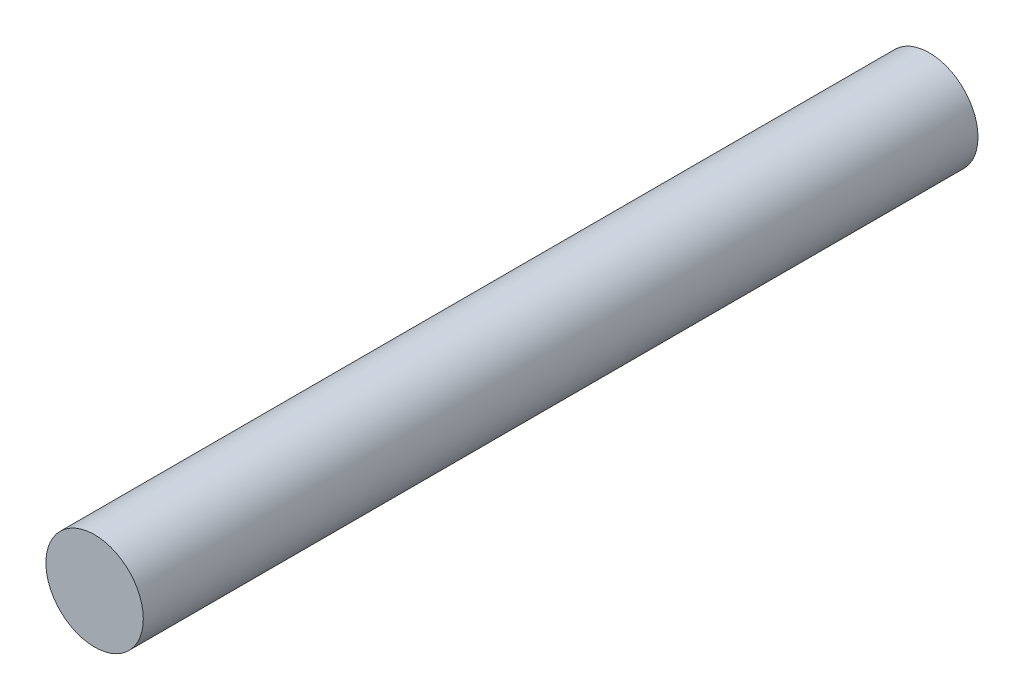
ISO-10303-21;
HEADER;
FILE_DESCRIPTION(('STEP AP214'),'2;1');
FILE_NAME('part.step','',(''),(''),'','','');
FILE_SCHEMA(('AUTOMOTIVE_DESIGN { 1 0 10303 214 1 1 1 1 }'));
ENDSEC;
DATA;
#1=APPLICATION_CONTEXT('core data for automotive mechanical design processes');
#2=APPLICATION_PROTOCOL_DEFINITION('international standard','automotive_design',2000,#1);
#3=PRODUCT_CONTEXT('',#1,'mechanical');
#4=PRODUCT('Part','Part','',(#3));
#5=PRODUCT_RELATED_PRODUCT_CATEGORY('part','',(#4));
#6=PRODUCT_DEFINITION_FORMATION('','',#4);
#7=PRODUCT_DEFINITION_CONTEXT('part definition',#1,'design');
#8=PRODUCT_DEFINITION('design','',#6,#7);
#9=PRODUCT_DEFINITION_SHAPE('','',#8);
#10=(LENGTH_UNIT() NAMED_UNIT(*) SI_UNIT(.MILLI.,.METRE.));
#11=(NAMED_UNIT(*) PLANE_ANGLE_UNIT() SI_UNIT($,.RADIAN.));
#12=(NAMED_UNIT(*) SI_UNIT($,.STERADIAN.) SOLID_ANGLE_UNIT());
#13=UNCERTAINTY_MEASURE_WITH_UNIT(LENGTH_MEASURE(1.E-05),#10,'distance_accuracy_value','');
#14=(GEOMETRIC_REPRESENTATION_CONTEXT(3) GLOBAL_UNCERTAINTY_ASSIGNED_CONTEXT((#13)) GLOBAL_UNIT_ASSIGNED_CONTEXT((#10,
#11,#12)) REPRESENTATION_CONTEXT('',''));
#15=CARTESIAN_POINT('',(0.,0.,0.));
#16=DIRECTION('',(0.,0.,1.));
#17=DIRECTION('',(1.,0.,0.));
#18=AXIS2_PLACEMENT_3D('',#15,#16,#17);
#19=CARTESIAN_POINT('',(0.,68.,-700.));
#20=DIRECTION('',(0.,0.,1.));
#21=DIRECTION('',(1.,0.,0.));
#22=AXIS2_PLACEMENT_3D('',#19,#20,#21);
#23=CYLINDRICAL_SURFACE('',#22,35.);
#24=CARTESIAN_POINT('',(0.,68.,-700.));
#25=DIRECTION('',(0.,0.,1.));
#26=DIRECTION('',(1.,0.,0.));
#27=AXIS2_PLACEMENT_3D('',#24,#25,#26);
#28=CIRCLE('',#27,35.);
#29=CARTESIAN_POINT('',(35.,68.,-700.));
#30=VERTEX_POINT('',#29);
#31=EDGE_CURVE('E10',#30,#30,#28,.T.);
#32=ORIENTED_EDGE('',*,*,#31,.T.);
#33=EDGE_LOOP('',(#32));
#34=FACE_BOUND('',#33,.T.);
#35=CARTESIAN_POINT('',(0.,68.,-100.));
#36=DIRECTION('',(0.,0.,1.));
#37=DIRECTION('',(1.,0.,0.));
#38=AXIS2_PLACEMENT_3D('',#35,#36,#37);
#39=CIRCLE('',#38,35.);
#40=CARTESIAN_POINT('',(35.,68.,-100.));
#41=VERTEX_POINT('',#40);
#42=EDGE_CURVE('E40',#41,#41,#39,.T.);
#43=ORIENTED_EDGE('',*,*,#42,.F.);
#44=EDGE_LOOP('',(#43));
#45=FACE_BOUND('',#44,.T.);
#46=ADVANCED_FACE('F37',(#34,#45),#23,.T.);
#47=CARTESIAN_POINT('',(0.,68.,-700.));
#48=DIRECTION('',(0.,0.,1.));
#49=DIRECTION('',(1.,0.,0.));
#50=AXIS2_PLACEMENT_3D('',#47,#48,#49);
#51=PLANE('',#50);
#52=ORIENTED_EDGE('',*,*,#31,.F.);
#53=EDGE_LOOP('',(#52));
#54=FACE_BOUND('',#53,.T.);
#55=ADVANCED_FACE('F52',(#54),#51,.F.);
#56=CARTESIAN_POINT('',(0.,68.,-100.));
#57=DIRECTION('',(0.,0.,1.));
#58=DIRECTION('',(1.,0.,0.));
#59=AXIS2_PLACEMENT_3D('',#56,#57,#58);
#60=PLANE('',#59);
#61=ORIENTED_EDGE('',*,*,#42,.T.);
#62=EDGE_LOOP('',(#61));
#63=FACE_BOUND('',#62,.T.);
#64=ADVANCED_FACE('F49',(#63),#60,.T.);
#65=CLOSED_SHELL('',(#46,#55,#64));
#66=MANIFOLD_SOLID_BREP('B2',#65);
#67=ADVANCED_BREP_SHAPE_REPRESENTATION('',(#18,#66),#14);
#68=SHAPE_DEFINITION_REPRESENTATION(#9,#67);
ENDSEC;
END-ISO-10303-21;
